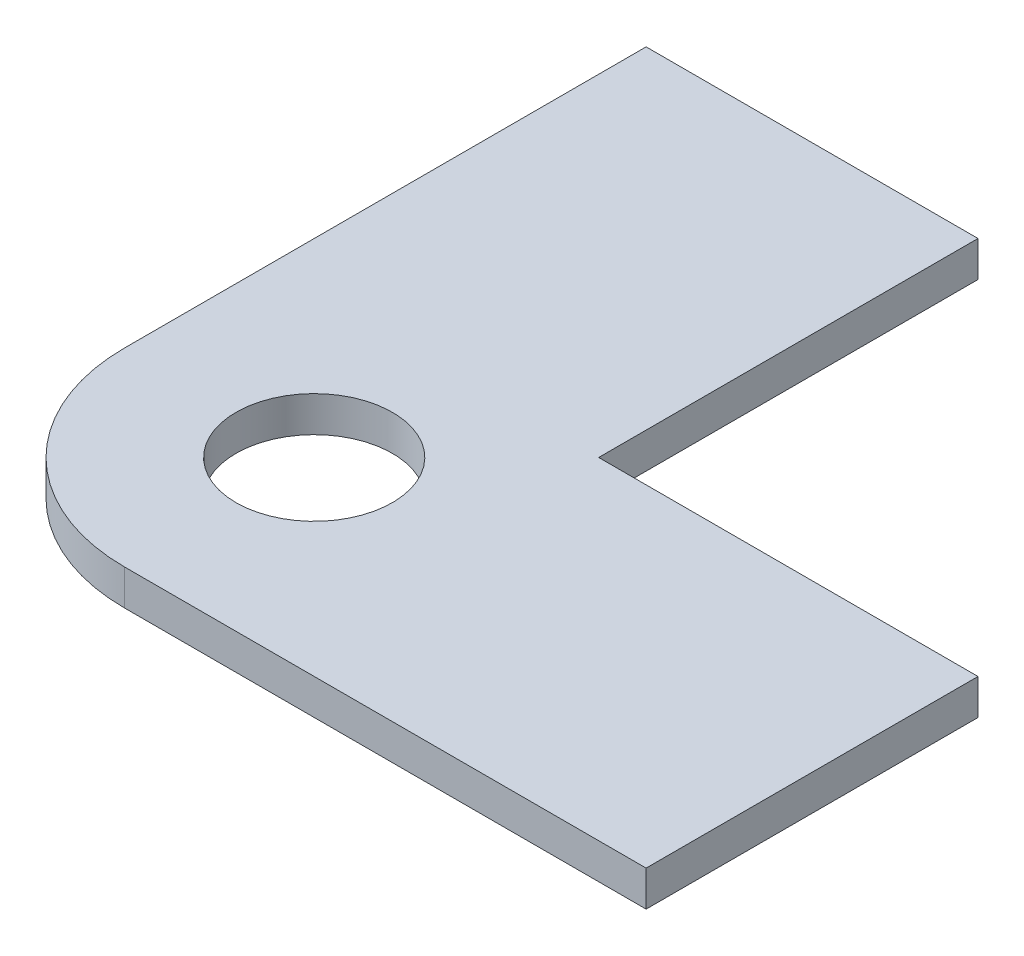
ISO-10303-21;
HEADER;
FILE_DESCRIPTION(('STEP AP214'),'2;1');
FILE_NAME('part.step','',(''),(''),'','','');
FILE_SCHEMA(('AUTOMOTIVE_DESIGN { 1 0 10303 214 1 1 1 1 }'));
ENDSEC;
DATA;
#1=APPLICATION_CONTEXT('core data for automotive mechanical design processes');
#2=APPLICATION_PROTOCOL_DEFINITION('international standard','automotive_design',2000,#1);
#3=PRODUCT_CONTEXT('',#1,'mechanical');
#4=PRODUCT('Part','Part','',(#3));
#5=PRODUCT_RELATED_PRODUCT_CATEGORY('part','',(#4));
#6=PRODUCT_DEFINITION_FORMATION('','',#4);
#7=PRODUCT_DEFINITION_CONTEXT('part definition',#1,'design');
#8=PRODUCT_DEFINITION('design','',#6,#7);
#9=PRODUCT_DEFINITION_SHAPE('','',#8);
#10=(LENGTH_UNIT() NAMED_UNIT(*) SI_UNIT(.MILLI.,.METRE.));
#11=(NAMED_UNIT(*) PLANE_ANGLE_UNIT() SI_UNIT($,.RADIAN.));
#12=(NAMED_UNIT(*) SI_UNIT($,.STERADIAN.) SOLID_ANGLE_UNIT());
#13=UNCERTAINTY_MEASURE_WITH_UNIT(LENGTH_MEASURE(1.E-05),#10,'distance_accuracy_value','');
#14=(GEOMETRIC_REPRESENTATION_CONTEXT(3) GLOBAL_UNCERTAINTY_ASSIGNED_CONTEXT((#13)) GLOBAL_UNIT_ASSIGNED_CONTEXT((#10,
#11,#12)) REPRESENTATION_CONTEXT('',''));
#15=CARTESIAN_POINT('',(0.,0.,0.));
#16=DIRECTION('',(0.,0.,1.));
#17=DIRECTION('',(1.,0.,0.));
#18=AXIS2_PLACEMENT_3D('',#15,#16,#17);
#19=CARTESIAN_POINT('',(0.,0.75,3.99967418048264));
#20=DIRECTION('',(0.,0.,-1.));
#21=DIRECTION('',(-1.,0.,0.));
#22=AXIS2_PLACEMENT_3D('',#19,#20,#21);
#23=PLANE('',#22);
#24=DIRECTION('',(1.,0.,0.));
#25=VECTOR('',#24,1.);
#26=CARTESIAN_POINT('',(0.,0.,3.99967418048264));
#27=LINE('',#26,#25);
#28=CARTESIAN_POINT('',(0.,0.,3.99967418048264));
#29=VERTEX_POINT('',#28);
#30=CARTESIAN_POINT('',(11.,0.,3.99967418048264));
#31=VERTEX_POINT('',#30);
#32=EDGE_CURVE('E142',#29,#31,#27,.T.);
#33=ORIENTED_EDGE('',*,*,#32,.T.);
#34=DIRECTION('',(0.,-1.,0.));
#35=VECTOR('',#34,1.);
#36=CARTESIAN_POINT('',(11.,0.75,3.99967418048264));
#37=LINE('',#36,#35);
#38=CARTESIAN_POINT('',(11.,0.75,3.99967418048264));
#39=VERTEX_POINT('',#38);
#40=EDGE_CURVE('E11',#39,#31,#37,.T.);
#41=ORIENTED_EDGE('',*,*,#40,.F.);
#42=DIRECTION('',(1.,0.,0.));
#43=VECTOR('',#42,1.);
#44=CARTESIAN_POINT('',(0.,0.75,3.99967418048264));
#45=LINE('',#44,#43);
#46=CARTESIAN_POINT('',(0.,0.75,3.99967418048264));
#47=VERTEX_POINT('',#46);
#48=EDGE_CURVE('E170',#47,#39,#45,.T.);
#49=ORIENTED_EDGE('',*,*,#48,.F.);
#50=DIRECTION('',(0.,-1.,0.));
#51=VECTOR('',#50,1.);
#52=CARTESIAN_POINT('',(0.,0.75,3.99967418048264));
#53=LINE('',#52,#51);
#54=EDGE_CURVE('E58',#47,#29,#53,.T.);
#55=ORIENTED_EDGE('',*,*,#54,.T.);
#56=EDGE_LOOP('',(#33,#41,#49,#55));
#57=FACE_BOUND('',#56,.T.);
#58=ADVANCED_FACE('F41',(#57),#23,.F.);
#59=CARTESIAN_POINT('',(11.,0.75,0.));
#60=DIRECTION('',(-1.,0.,0.));
#61=DIRECTION('',(0.,0.,1.));
#62=AXIS2_PLACEMENT_3D('',#59,#60,#61);
#63=PLANE('',#62);
#64=DIRECTION('',(0.,0.,-1.));
#65=VECTOR('',#64,1.);
#66=CARTESIAN_POINT('',(11.,0.,0.));
#67=LINE('',#66,#65);
#68=CARTESIAN_POINT('',(11.,0.,-3.));
#69=VERTEX_POINT('',#68);
#70=EDGE_CURVE('E145',#31,#69,#67,.T.);
#71=ORIENTED_EDGE('',*,*,#70,.T.);
#72=DIRECTION('',(0.,-1.,0.));
#73=VECTOR('',#72,1.);
#74=CARTESIAN_POINT('',(11.,0.75,-3.));
#75=LINE('',#74,#73);
#76=CARTESIAN_POINT('',(11.,0.75,-3.));
#77=VERTEX_POINT('',#76);
#78=EDGE_CURVE('E50',#77,#69,#75,.T.);
#79=ORIENTED_EDGE('',*,*,#78,.F.);
#80=DIRECTION('',(0.,0.,-1.));
#81=VECTOR('',#80,1.);
#82=CARTESIAN_POINT('',(11.,0.75,0.));
#83=LINE('',#82,#81);
#84=EDGE_CURVE('E93',#39,#77,#83,.T.);
#85=ORIENTED_EDGE('',*,*,#84,.F.);
#86=ORIENTED_EDGE('',*,*,#40,.T.);
#87=EDGE_LOOP('',(#71,#79,#85,#86));
#88=FACE_BOUND('',#87,.T.);
#89=ADVANCED_FACE('F185',(#88),#63,.F.);
#90=CARTESIAN_POINT('',(0.,0.75,-3.));
#91=DIRECTION('',(0.,0.,-1.));
#92=DIRECTION('',(-1.,0.,0.));
#93=AXIS2_PLACEMENT_3D('',#90,#91,#92);
#94=PLANE('',#93);
#95=DIRECTION('',(1.,0.,0.));
#96=VECTOR('',#95,1.);
#97=CARTESIAN_POINT('',(0.,0.,-3.));
#98=LINE('',#97,#96);
#99=CARTESIAN_POINT('',(3.,0.,-3.));
#100=VERTEX_POINT('',#99);
#101=EDGE_CURVE('E149',#100,#69,#98,.T.);
#102=ORIENTED_EDGE('',*,*,#101,.F.);
#103=DIRECTION('',(0.,-1.,0.));
#104=VECTOR('',#103,1.);
#105=CARTESIAN_POINT('',(3.,0.75,-3.));
#106=LINE('',#105,#104);
#107=CARTESIAN_POINT('',(3.,0.75,-3.));
#108=VERTEX_POINT('',#107);
#109=EDGE_CURVE('E177',#108,#100,#106,.T.);
#110=ORIENTED_EDGE('',*,*,#109,.F.);
#111=DIRECTION('',(1.,0.,0.));
#112=VECTOR('',#111,1.);
#113=CARTESIAN_POINT('',(0.,0.75,-3.));
#114=LINE('',#113,#112);
#115=EDGE_CURVE('E184',#108,#77,#114,.T.);
#116=ORIENTED_EDGE('',*,*,#115,.T.);
#117=ORIENTED_EDGE('',*,*,#78,.T.);
#118=EDGE_LOOP('',(#102,#110,#116,#117));
#119=FACE_BOUND('',#118,.T.);
#120=ADVANCED_FACE('F183',(#119),#94,.T.);
#121=CARTESIAN_POINT('',(3.,0.75,0.));
#122=DIRECTION('',(1.,0.,0.));
#123=DIRECTION('',(0.,0.,-1.));
#124=AXIS2_PLACEMENT_3D('',#121,#122,#123);
#125=PLANE('',#124);
#126=DIRECTION('',(0.,0.,1.));
#127=VECTOR('',#126,1.);
#128=CARTESIAN_POINT('',(3.,0.,0.));
#129=LINE('',#128,#127);
#130=CARTESIAN_POINT('',(3.,0.,-11.));
#131=VERTEX_POINT('',#130);
#132=EDGE_CURVE('E153',#131,#100,#129,.T.);
#133=ORIENTED_EDGE('',*,*,#132,.F.);
#134=DIRECTION('',(0.,-1.,0.));
#135=VECTOR('',#134,1.);
#136=CARTESIAN_POINT('',(3.,0.75,-11.));
#137=LINE('',#136,#135);
#138=CARTESIAN_POINT('',(3.,0.75,-11.));
#139=VERTEX_POINT('',#138);
#140=EDGE_CURVE('E116',#139,#131,#137,.T.);
#141=ORIENTED_EDGE('',*,*,#140,.F.);
#142=DIRECTION('',(0.,0.,1.));
#143=VECTOR('',#142,1.);
#144=CARTESIAN_POINT('',(3.,0.75,0.));
#145=LINE('',#144,#143);
#146=EDGE_CURVE('E127',#139,#108,#145,.T.);
#147=ORIENTED_EDGE('',*,*,#146,.T.);
#148=ORIENTED_EDGE('',*,*,#109,.T.);
#149=EDGE_LOOP('',(#133,#141,#147,#148));
#150=FACE_BOUND('',#149,.T.);
#151=ADVANCED_FACE('F192',(#150),#125,.T.);
#152=CARTESIAN_POINT('',(0.,0.75,-11.));
#153=DIRECTION('',(0.,0.,-1.));
#154=DIRECTION('',(-1.,0.,0.));
#155=AXIS2_PLACEMENT_3D('',#152,#153,#154);
#156=PLANE('',#155);
#157=DIRECTION('',(1.,0.,0.));
#158=VECTOR('',#157,1.);
#159=CARTESIAN_POINT('',(0.,0.,-11.));
#160=LINE('',#159,#158);
#161=CARTESIAN_POINT('',(-3.99967418048264,0.,-11.));
#162=VERTEX_POINT('',#161);
#163=EDGE_CURVE('E111',#162,#131,#160,.T.);
#164=ORIENTED_EDGE('',*,*,#163,.F.);
#165=DIRECTION('',(0.,-1.,0.));
#166=VECTOR('',#165,1.);
#167=CARTESIAN_POINT('',(-3.99967418048264,0.75,-11.));
#168=LINE('',#167,#166);
#169=CARTESIAN_POINT('',(-3.99967418048264,0.75,-11.));
#170=VERTEX_POINT('',#169);
#171=EDGE_CURVE('E106',#170,#162,#168,.T.);
#172=ORIENTED_EDGE('',*,*,#171,.F.);
#173=DIRECTION('',(1.,0.,0.));
#174=VECTOR('',#173,1.);
#175=CARTESIAN_POINT('',(0.,0.75,-11.));
#176=LINE('',#175,#174);
#177=EDGE_CURVE('E109',#170,#139,#176,.T.);
#178=ORIENTED_EDGE('',*,*,#177,.T.);
#179=ORIENTED_EDGE('',*,*,#140,.T.);
#180=EDGE_LOOP('',(#164,#172,#178,#179));
#181=FACE_BOUND('',#180,.T.);
#182=ADVANCED_FACE('F108',(#181),#156,.T.);
#183=CARTESIAN_POINT('',(-3.99967418048264,0.75,0.));
#184=DIRECTION('',(-1.,0.,0.));
#185=DIRECTION('',(0.,0.,1.));
#186=AXIS2_PLACEMENT_3D('',#183,#184,#185);
#187=PLANE('',#186);
#188=DIRECTION('',(0.,0.,-1.));
#189=VECTOR('',#188,1.);
#190=CARTESIAN_POINT('',(-3.99967418048264,0.,0.));
#191=LINE('',#190,#189);
#192=CARTESIAN_POINT('',(-3.99967418048264,0.,0.));
#193=VERTEX_POINT('',#192);
#194=EDGE_CURVE('E159',#193,#162,#191,.T.);
#195=ORIENTED_EDGE('',*,*,#194,.F.);
#196=DIRECTION('',(0.,-1.,0.));
#197=VECTOR('',#196,1.);
#198=CARTESIAN_POINT('',(-3.99967418048264,0.75,0.));
#199=LINE('',#198,#197);
#200=CARTESIAN_POINT('',(-3.99967418048264,0.75,0.));
#201=VERTEX_POINT('',#200);
#202=EDGE_CURVE('E81',#201,#193,#199,.T.);
#203=ORIENTED_EDGE('',*,*,#202,.F.);
#204=DIRECTION('',(0.,0.,-1.));
#205=VECTOR('',#204,1.);
#206=CARTESIAN_POINT('',(-3.99967418048264,0.75,0.));
#207=LINE('',#206,#205);
#208=EDGE_CURVE('E124',#201,#170,#207,.T.);
#209=ORIENTED_EDGE('',*,*,#208,.T.);
#210=ORIENTED_EDGE('',*,*,#171,.T.);
#211=EDGE_LOOP('',(#195,#203,#209,#210));
#212=FACE_BOUND('',#211,.T.);
#213=ADVANCED_FACE('F130',(#212),#187,.T.);
#214=CARTESIAN_POINT('',(0.,0.75,0.));
#215=DIRECTION('',(0.,-1.,0.));
#216=DIRECTION('',(0.,0.,-1.));
#217=AXIS2_PLACEMENT_3D('',#214,#215,#216);
#218=CYLINDRICAL_SURFACE('',#217,3.99967418048264);
#219=CARTESIAN_POINT('',(0.,0.,0.));
#220=DIRECTION('',(0.,1.,0.));
#221=DIRECTION('',(0.,0.,1.));
#222=AXIS2_PLACEMENT_3D('',#219,#220,#221);
#223=CIRCLE('',#222,3.99967418048264);
#224=EDGE_CURVE('E162',#29,#193,#223,.F.);
#225=ORIENTED_EDGE('',*,*,#224,.F.);
#226=ORIENTED_EDGE('',*,*,#54,.F.);
#227=CARTESIAN_POINT('',(0.,0.75,0.));
#228=DIRECTION('',(0.,1.,0.));
#229=DIRECTION('',(0.,0.,1.));
#230=AXIS2_PLACEMENT_3D('',#227,#228,#229);
#231=CIRCLE('',#230,3.99967418048264);
#232=EDGE_CURVE('E132',#47,#201,#231,.F.);
#233=ORIENTED_EDGE('',*,*,#232,.T.);
#234=ORIENTED_EDGE('',*,*,#202,.T.);
#235=EDGE_LOOP('',(#225,#226,#233,#234));
#236=FACE_BOUND('',#235,.T.);
#237=ADVANCED_FACE('F200',(#236),#218,.T.);
#238=CARTESIAN_POINT('',(0.,0.75,0.));
#239=DIRECTION('',(0.,-1.,0.));
#240=DIRECTION('',(0.,0.,-1.));
#241=AXIS2_PLACEMENT_3D('',#238,#239,#240);
#242=CYLINDRICAL_SURFACE('',#241,1.65);
#243=CARTESIAN_POINT('',(0.,0.75,0.));
#244=DIRECTION('',(0.,1.,0.));
#245=DIRECTION('',(0.,0.,1.));
#246=AXIS2_PLACEMENT_3D('',#243,#244,#245);
#247=CIRCLE('',#246,1.65);
#248=CARTESIAN_POINT('',(0.,0.75,1.65));
#249=VERTEX_POINT('',#248);
#250=EDGE_CURVE('E135',#249,#249,#247,.T.);
#251=ORIENTED_EDGE('',*,*,#250,.T.);
#252=EDGE_LOOP('',(#251));
#253=FACE_BOUND('',#252,.T.);
#254=CARTESIAN_POINT('',(0.,0.,0.));
#255=DIRECTION('',(0.,1.,0.));
#256=DIRECTION('',(0.,0.,1.));
#257=AXIS2_PLACEMENT_3D('',#254,#255,#256);
#258=CIRCLE('',#257,1.65);
#259=CARTESIAN_POINT('',(0.,0.,1.65));
#260=VERTEX_POINT('',#259);
#261=EDGE_CURVE('E166',#260,#260,#258,.T.);
#262=ORIENTED_EDGE('',*,*,#261,.F.);
#263=EDGE_LOOP('',(#262));
#264=FACE_BOUND('',#263,.T.);
#265=ADVANCED_FACE('F202',(#253,#264),#242,.F.);
#266=CARTESIAN_POINT('',(0.,0.75,0.));
#267=DIRECTION('',(0.,1.,0.));
#268=DIRECTION('',(0.,0.,1.));
#269=AXIS2_PLACEMENT_3D('',#266,#267,#268);
#270=PLANE('',#269);
#271=ORIENTED_EDGE('',*,*,#48,.T.);
#272=ORIENTED_EDGE('',*,*,#84,.T.);
#273=ORIENTED_EDGE('',*,*,#115,.F.);
#274=ORIENTED_EDGE('',*,*,#146,.F.);
#275=ORIENTED_EDGE('',*,*,#177,.F.);
#276=ORIENTED_EDGE('',*,*,#208,.F.);
#277=ORIENTED_EDGE('',*,*,#232,.F.);
#278=EDGE_LOOP('',(#271,#272,#273,#274,#275,#276,#277));
#279=FACE_BOUND('',#278,.T.);
#280=ORIENTED_EDGE('',*,*,#250,.F.);
#281=EDGE_LOOP('',(#280));
#282=FACE_BOUND('',#281,.T.);
#283=ADVANCED_FACE('F121',(#279,#282),#270,.T.);
#284=CARTESIAN_POINT('',(0.,0.,0.));
#285=DIRECTION('',(0.,1.,0.));
#286=DIRECTION('',(0.,0.,1.));
#287=AXIS2_PLACEMENT_3D('',#284,#285,#286);
#288=PLANE('',#287);
#289=ORIENTED_EDGE('',*,*,#32,.F.);
#290=ORIENTED_EDGE('',*,*,#224,.T.);
#291=ORIENTED_EDGE('',*,*,#194,.T.);
#292=ORIENTED_EDGE('',*,*,#163,.T.);
#293=ORIENTED_EDGE('',*,*,#132,.T.);
#294=ORIENTED_EDGE('',*,*,#101,.T.);
#295=ORIENTED_EDGE('',*,*,#70,.F.);
#296=EDGE_LOOP('',(#289,#290,#291,#292,#293,#294,#295));
#297=FACE_BOUND('',#296,.T.);
#298=ORIENTED_EDGE('',*,*,#261,.T.);
#299=EDGE_LOOP('',(#298));
#300=FACE_BOUND('',#299,.T.);
#301=ADVANCED_FACE('F188',(#297,#300),#288,.F.);
#302=CLOSED_SHELL('',(#58,#89,#120,#151,#182,#213,#237,#265,#283,#301));
#303=MANIFOLD_SOLID_BREP('B2',#302);
#304=ADVANCED_BREP_SHAPE_REPRESENTATION('',(#18,#303),#14);
#305=SHAPE_DEFINITION_REPRESENTATION(#9,#304);
ENDSEC;
END-ISO-10303-21;
